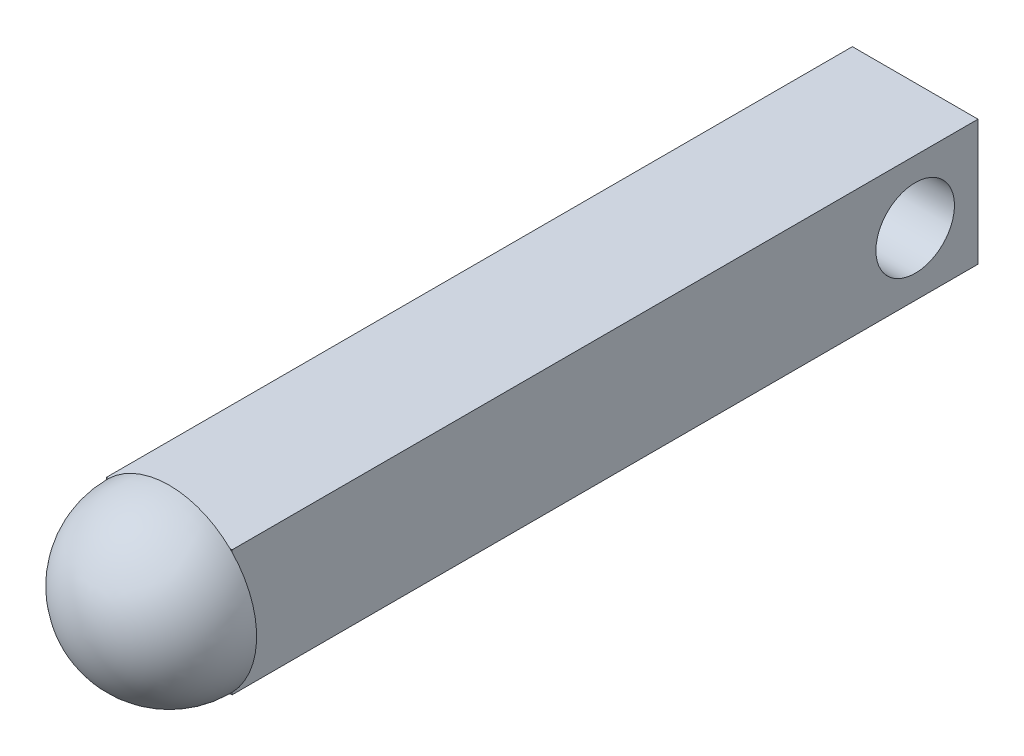
ISO-10303-21;
HEADER;
FILE_DESCRIPTION(('STEP AP214'),'2;1');
FILE_NAME('part.step','',(''),(''),'','','');
FILE_SCHEMA(('AUTOMOTIVE_DESIGN { 1 0 10303 214 1 1 1 1 }'));
ENDSEC;
DATA;
#1=APPLICATION_CONTEXT('core data for automotive mechanical design processes');
#2=APPLICATION_PROTOCOL_DEFINITION('international standard','automotive_design',2000,#1);
#3=PRODUCT_CONTEXT('',#1,'mechanical');
#4=PRODUCT('Part','Part','',(#3));
#5=PRODUCT_RELATED_PRODUCT_CATEGORY('part','',(#4));
#6=PRODUCT_DEFINITION_FORMATION('','',#4);
#7=PRODUCT_DEFINITION_CONTEXT('part definition',#1,'design');
#8=PRODUCT_DEFINITION('design','',#6,#7);
#9=PRODUCT_DEFINITION_SHAPE('','',#8);
#10=(LENGTH_UNIT() NAMED_UNIT(*) SI_UNIT(.MILLI.,.METRE.));
#11=(NAMED_UNIT(*) PLANE_ANGLE_UNIT() SI_UNIT($,.RADIAN.));
#12=(NAMED_UNIT(*) SI_UNIT($,.STERADIAN.) SOLID_ANGLE_UNIT());
#13=UNCERTAINTY_MEASURE_WITH_UNIT(LENGTH_MEASURE(1.E-05),#10,'distance_accuracy_value','');
#14=(GEOMETRIC_REPRESENTATION_CONTEXT(3) GLOBAL_UNCERTAINTY_ASSIGNED_CONTEXT((#13)) GLOBAL_UNIT_ASSIGNED_CONTEXT((#10,
#11,#12)) REPRESENTATION_CONTEXT('',''));
#15=CARTESIAN_POINT('',(0.,0.,0.));
#16=DIRECTION('',(0.,0.,1.));
#17=DIRECTION('',(1.,0.,0.));
#18=AXIS2_PLACEMENT_3D('',#15,#16,#17);
#19=CARTESIAN_POINT('',(0.,0.,95.));
#20=DIRECTION('',(0.,0.,-1.));
#21=DIRECTION('',(-1.,0.,0.));
#22=AXIS2_PLACEMENT_3D('',#19,#20,#21);
#23=PLANE('',#22);
#24=DIRECTION('',(0.,-1.,0.));
#25=VECTOR('',#24,1.);
#26=CARTESIAN_POINT('',(-8.,-8.,95.));
#27=LINE('',#26,#25);
#28=CARTESIAN_POINT('',(-8.,8.,95.));
#29=VERTEX_POINT('',#28);
#30=CARTESIAN_POINT('',(-8.,7.73115408192045,95.));
#31=VERTEX_POINT('',#30);
#32=EDGE_CURVE('E137',#29,#31,#27,.T.);
#33=ORIENTED_EDGE('',*,*,#32,.T.);
#34=CARTESIAN_POINT('',(0.,0.,95.));
#35=DIRECTION('',(0.,0.,-1.));
#36=DIRECTION('',(-1.,0.,0.));
#37=AXIS2_PLACEMENT_3D('',#34,#35,#36);
#38=CIRCLE('',#37,11.1252300397967);
#39=CARTESIAN_POINT('',(-7.73115408192046,8.,95.));
#40=VERTEX_POINT('',#39);
#41=EDGE_CURVE('E11',#31,#40,#38,.T.);
#42=ORIENTED_EDGE('',*,*,#41,.T.);
#43=DIRECTION('',(-1.,0.,0.));
#44=VECTOR('',#43,1.);
#45=CARTESIAN_POINT('',(-8.,8.,95.));
#46=LINE('',#45,#44);
#47=EDGE_CURVE('E131',#40,#29,#46,.T.);
#48=ORIENTED_EDGE('',*,*,#47,.T.);
#49=EDGE_LOOP('',(#33,#42,#48));
#50=FACE_BOUND('',#49,.T.);
#51=ADVANCED_FACE('F34',(#50),#23,.F.);
#52=CARTESIAN_POINT('',(8.,8.,95.));
#53=VERTEX_POINT('',#52);
#54=CARTESIAN_POINT('',(7.73115408192046,8.,95.));
#55=VERTEX_POINT('',#54);
#56=EDGE_CURVE('E128',#53,#55,#46,.T.);
#57=ORIENTED_EDGE('',*,*,#56,.T.);
#58=CARTESIAN_POINT('',(0.,0.,95.));
#59=DIRECTION('',(0.,0.,-1.));
#60=DIRECTION('',(0.,1.,0.));
#61=AXIS2_PLACEMENT_3D('',#58,#59,#60);
#62=CIRCLE('',#61,11.1252300397967);
#63=CARTESIAN_POINT('',(7.99999999999999,7.73115408192046,95.));
#64=VERTEX_POINT('',#63);
#65=EDGE_CURVE('E118',#55,#64,#62,.T.);
#66=ORIENTED_EDGE('',*,*,#65,.T.);
#67=DIRECTION('',(0.,1.,0.));
#68=VECTOR('',#67,1.);
#69=CARTESIAN_POINT('',(8.,-8.,95.));
#70=LINE('',#69,#68);
#71=EDGE_CURVE('E89',#64,#53,#70,.T.);
#72=ORIENTED_EDGE('',*,*,#71,.T.);
#73=EDGE_LOOP('',(#57,#66,#72));
#74=FACE_BOUND('',#73,.T.);
#75=ADVANCED_FACE('F133',(#74),#23,.F.);
#76=CARTESIAN_POINT('',(8.,-8.,95.));
#77=VERTEX_POINT('',#76);
#78=CARTESIAN_POINT('',(7.99999999999999,-7.73115408192046,95.));
#79=VERTEX_POINT('',#78);
#80=EDGE_CURVE('E139',#77,#79,#70,.T.);
#81=ORIENTED_EDGE('',*,*,#80,.T.);
#82=CARTESIAN_POINT('',(7.73115408192046,-8.,95.));
#83=VERTEX_POINT('',#82);
#84=EDGE_CURVE('E43',#79,#83,#38,.T.);
#85=ORIENTED_EDGE('',*,*,#84,.T.);
#86=DIRECTION('',(1.,0.,0.));
#87=VECTOR('',#86,1.);
#88=CARTESIAN_POINT('',(-8.,-8.,95.));
#89=LINE('',#88,#87);
#90=EDGE_CURVE('E59',#83,#77,#89,.T.);
#91=ORIENTED_EDGE('',*,*,#90,.T.);
#92=EDGE_LOOP('',(#81,#85,#91));
#93=FACE_BOUND('',#92,.T.);
#94=ADVANCED_FACE('F164',(#93),#23,.F.);
#95=CARTESIAN_POINT('',(8.,-8.,95.));
#96=DIRECTION('',(-1.,0.,0.));
#97=DIRECTION('',(0.,0.,1.));
#98=AXIS2_PLACEMENT_3D('',#95,#96,#97);
#99=PLANE('',#98);
#100=CARTESIAN_POINT('',(7.99999999999999,0.,8.));
#101=DIRECTION('',(-1.,0.,0.));
#102=DIRECTION('',(0.,0.,1.));
#103=AXIS2_PLACEMENT_3D('',#100,#101,#102);
#104=CIRCLE('',#103,5.);
#105=CARTESIAN_POINT('',(7.99999999999999,0.,13.));
#106=VERTEX_POINT('',#105);
#107=EDGE_CURVE('E181',#106,#106,#104,.T.);
#108=ORIENTED_EDGE('',*,*,#107,.T.);
#109=EDGE_LOOP('',(#108));
#110=FACE_BOUND('',#109,.T.);
#111=DIRECTION('',(0.,1.,0.));
#112=VECTOR('',#111,1.);
#113=CARTESIAN_POINT('',(8.,-8.,0.));
#114=LINE('',#113,#112);
#115=CARTESIAN_POINT('',(8.,-8.,0.));
#116=VERTEX_POINT('',#115);
#117=CARTESIAN_POINT('',(8.,8.,0.));
#118=VERTEX_POINT('',#117);
#119=EDGE_CURVE('E179',#116,#118,#114,.T.);
#120=ORIENTED_EDGE('',*,*,#119,.T.);
#121=DIRECTION('',(0.,0.,-1.));
#122=VECTOR('',#121,1.);
#123=CARTESIAN_POINT('',(8.,8.,95.));
#124=LINE('',#123,#122);
#125=EDGE_CURVE('E158',#53,#118,#124,.T.);
#126=ORIENTED_EDGE('',*,*,#125,.F.);
#127=ORIENTED_EDGE('',*,*,#71,.F.);
#128=EDGE_CURVE('E142',#79,#64,#70,.T.);
#129=ORIENTED_EDGE('',*,*,#128,.F.);
#130=ORIENTED_EDGE('',*,*,#80,.F.);
#131=DIRECTION('',(0.,0.,-1.));
#132=VECTOR('',#131,1.);
#133=CARTESIAN_POINT('',(8.,-8.,95.));
#134=LINE('',#133,#132);
#135=EDGE_CURVE('E151',#77,#116,#134,.T.);
#136=ORIENTED_EDGE('',*,*,#135,.T.);
#137=EDGE_LOOP('',(#120,#126,#127,#129,#130,#136));
#138=FACE_BOUND('',#137,.T.);
#139=ADVANCED_FACE('F36',(#110,#138),#99,.F.);
#140=CARTESIAN_POINT('',(-8.,8.,95.));
#141=DIRECTION('',(0.,-1.,0.));
#142=DIRECTION('',(0.,0.,-1.));
#143=AXIS2_PLACEMENT_3D('',#140,#141,#142);
#144=PLANE('',#143);
#145=DIRECTION('',(-1.,0.,0.));
#146=VECTOR('',#145,1.);
#147=CARTESIAN_POINT('',(-8.,8.,0.));
#148=LINE('',#147,#146);
#149=CARTESIAN_POINT('',(-8.,8.,0.));
#150=VERTEX_POINT('',#149);
#151=EDGE_CURVE('E147',#118,#150,#148,.T.);
#152=ORIENTED_EDGE('',*,*,#151,.T.);
#153=DIRECTION('',(0.,0.,-1.));
#154=VECTOR('',#153,1.);
#155=CARTESIAN_POINT('',(-8.,8.,95.));
#156=LINE('',#155,#154);
#157=EDGE_CURVE('E156',#29,#150,#156,.T.);
#158=ORIENTED_EDGE('',*,*,#157,.F.);
#159=ORIENTED_EDGE('',*,*,#47,.F.);
#160=EDGE_CURVE('E116',#55,#40,#46,.T.);
#161=ORIENTED_EDGE('',*,*,#160,.F.);
#162=ORIENTED_EDGE('',*,*,#56,.F.);
#163=ORIENTED_EDGE('',*,*,#125,.T.);
#164=EDGE_LOOP('',(#152,#158,#159,#161,#162,#163));
#165=FACE_BOUND('',#164,.T.);
#166=ADVANCED_FACE('F126',(#165),#144,.F.);
#167=CARTESIAN_POINT('',(-8.,-8.,95.));
#168=DIRECTION('',(1.,0.,0.));
#169=DIRECTION('',(0.,0.,-1.));
#170=AXIS2_PLACEMENT_3D('',#167,#168,#169);
#171=PLANE('',#170);
#172=CARTESIAN_POINT('',(-8.,0.,8.));
#173=DIRECTION('',(-1.,0.,0.));
#174=DIRECTION('',(0.,0.,1.));
#175=AXIS2_PLACEMENT_3D('',#172,#173,#174);
#176=CIRCLE('',#175,5.);
#177=CARTESIAN_POINT('',(-8.,0.,13.));
#178=VERTEX_POINT('',#177);
#179=EDGE_CURVE('E123',#178,#178,#176,.T.);
#180=ORIENTED_EDGE('',*,*,#179,.F.);
#181=EDGE_LOOP('',(#180));
#182=FACE_BOUND('',#181,.T.);
#183=DIRECTION('',(0.,-1.,0.));
#184=VECTOR('',#183,1.);
#185=CARTESIAN_POINT('',(-8.,-8.,0.));
#186=LINE('',#185,#184);
#187=CARTESIAN_POINT('',(-8.,-8.,0.));
#188=VERTEX_POINT('',#187);
#189=EDGE_CURVE('E145',#150,#188,#186,.T.);
#190=ORIENTED_EDGE('',*,*,#189,.T.);
#191=DIRECTION('',(0.,0.,-1.));
#192=VECTOR('',#191,1.);
#193=CARTESIAN_POINT('',(-8.,-8.,95.));
#194=LINE('',#193,#192);
#195=CARTESIAN_POINT('',(-8.,-8.,95.));
#196=VERTEX_POINT('',#195);
#197=EDGE_CURVE('E153',#196,#188,#194,.T.);
#198=ORIENTED_EDGE('',*,*,#197,.F.);
#199=CARTESIAN_POINT('',(-8.,-7.73115408192046,95.));
#200=VERTEX_POINT('',#199);
#201=EDGE_CURVE('E134',#200,#196,#27,.T.);
#202=ORIENTED_EDGE('',*,*,#201,.F.);
#203=EDGE_CURVE('E135',#31,#200,#27,.T.);
#204=ORIENTED_EDGE('',*,*,#203,.F.);
#205=ORIENTED_EDGE('',*,*,#32,.F.);
#206=ORIENTED_EDGE('',*,*,#157,.T.);
#207=EDGE_LOOP('',(#190,#198,#202,#204,#205,#206));
#208=FACE_BOUND('',#207,.T.);
#209=ADVANCED_FACE('F192',(#182,#208),#171,.F.);
#210=CARTESIAN_POINT('',(-8.,-8.,95.));
#211=DIRECTION('',(0.,1.,0.));
#212=DIRECTION('',(0.,0.,1.));
#213=AXIS2_PLACEMENT_3D('',#210,#211,#212);
#214=PLANE('',#213);
#215=DIRECTION('',(1.,0.,0.));
#216=VECTOR('',#215,1.);
#217=CARTESIAN_POINT('',(-8.,-8.,0.));
#218=LINE('',#217,#216);
#219=EDGE_CURVE('E81',#188,#116,#218,.T.);
#220=ORIENTED_EDGE('',*,*,#219,.T.);
#221=ORIENTED_EDGE('',*,*,#135,.F.);
#222=ORIENTED_EDGE('',*,*,#90,.F.);
#223=CARTESIAN_POINT('',(-7.73115408192046,-8.,95.));
#224=VERTEX_POINT('',#223);
#225=EDGE_CURVE('E169',#224,#83,#89,.T.);
#226=ORIENTED_EDGE('',*,*,#225,.F.);
#227=EDGE_CURVE('E154',#196,#224,#89,.T.);
#228=ORIENTED_EDGE('',*,*,#227,.F.);
#229=ORIENTED_EDGE('',*,*,#197,.T.);
#230=EDGE_LOOP('',(#220,#221,#222,#226,#228,#229));
#231=FACE_BOUND('',#230,.T.);
#232=ADVANCED_FACE('F167',(#231),#214,.F.);
#233=ORIENTED_EDGE('',*,*,#227,.T.);
#234=EDGE_CURVE('E38',#224,#200,#38,.T.);
#235=ORIENTED_EDGE('',*,*,#234,.T.);
#236=ORIENTED_EDGE('',*,*,#201,.T.);
#237=EDGE_LOOP('',(#233,#235,#236));
#238=FACE_BOUND('',#237,.T.);
#239=ADVANCED_FACE('F172',(#238),#23,.F.);
#240=CARTESIAN_POINT('',(0.,0.,0.));
#241=DIRECTION('',(0.,0.,-1.));
#242=DIRECTION('',(-1.,0.,0.));
#243=AXIS2_PLACEMENT_3D('',#240,#241,#242);
#244=PLANE('',#243);
#245=ORIENTED_EDGE('',*,*,#119,.F.);
#246=ORIENTED_EDGE('',*,*,#219,.F.);
#247=ORIENTED_EDGE('',*,*,#189,.F.);
#248=ORIENTED_EDGE('',*,*,#151,.F.);
#249=EDGE_LOOP('',(#245,#246,#247,#248));
#250=FACE_BOUND('',#249,.T.);
#251=ADVANCED_FACE('F178',(#250),#244,.T.);
#252=CARTESIAN_POINT('',(67.,0.,8.));
#253=DIRECTION('',(-1.,0.,0.));
#254=DIRECTION('',(0.,0.,1.));
#255=AXIS2_PLACEMENT_3D('',#252,#253,#254);
#256=CYLINDRICAL_SURFACE('',#255,5.);
#257=ORIENTED_EDGE('',*,*,#179,.T.);
#258=EDGE_LOOP('',(#257));
#259=FACE_BOUND('',#258,.T.);
#260=ORIENTED_EDGE('',*,*,#107,.F.);
#261=EDGE_LOOP('',(#260));
#262=FACE_BOUND('',#261,.T.);
#263=ADVANCED_FACE('F189',(#259,#262),#256,.F.);
#264=CARTESIAN_POINT('',(0.,11.1252300397967,95.));
#265=DIRECTION('',(0.,0.,-1.));
#266=DIRECTION('',(0.,1.,0.));
#267=AXIS2_PLACEMENT_3D('',#264,#265,#266);
#268=PLANE('',#267);
#269=ORIENTED_EDGE('',*,*,#128,.T.);
#270=EDGE_CURVE('E122',#64,#79,#62,.T.);
#271=ORIENTED_EDGE('',*,*,#270,.T.);
#272=EDGE_LOOP('',(#269,#271));
#273=FACE_BOUND('',#272,.T.);
#274=ADVANCED_FACE('F204',(#273),#268,.T.);
#275=ORIENTED_EDGE('',*,*,#160,.T.);
#276=EDGE_CURVE('E112',#40,#55,#62,.T.);
#277=ORIENTED_EDGE('',*,*,#276,.T.);
#278=EDGE_LOOP('',(#275,#277));
#279=FACE_BOUND('',#278,.T.);
#280=ADVANCED_FACE('F114',(#279),#268,.T.);
#281=ORIENTED_EDGE('',*,*,#203,.T.);
#282=EDGE_CURVE('E50',#200,#31,#62,.T.);
#283=ORIENTED_EDGE('',*,*,#282,.T.);
#284=EDGE_LOOP('',(#281,#283));
#285=FACE_BOUND('',#284,.T.);
#286=ADVANCED_FACE('F198',(#285),#268,.T.);
#287=ORIENTED_EDGE('',*,*,#225,.T.);
#288=EDGE_CURVE('E199',#83,#224,#62,.T.);
#289=ORIENTED_EDGE('',*,*,#288,.T.);
#290=EDGE_LOOP('',(#287,#289));
#291=FACE_BOUND('',#290,.T.);
#292=ADVANCED_FACE('F284',(#291),#268,.T.);
#293=CARTESIAN_POINT('',(0.,0.,95.));
#294=DIRECTION('',(0.,0.,-1.));
#295=DIRECTION('',(0.,1.,0.));
#296=AXIS2_PLACEMENT_3D('',#293,#294,#295);
#297=SPHERICAL_SURFACE('',#296,11.1252300397967);
#298=ORIENTED_EDGE('',*,*,#65,.F.);
#299=ORIENTED_EDGE('',*,*,#276,.F.);
#300=ORIENTED_EDGE('',*,*,#41,.F.);
#301=ORIENTED_EDGE('',*,*,#282,.F.);
#302=ORIENTED_EDGE('',*,*,#234,.F.);
#303=ORIENTED_EDGE('',*,*,#288,.F.);
#304=ORIENTED_EDGE('',*,*,#84,.F.);
#305=ORIENTED_EDGE('',*,*,#270,.F.);
#306=EDGE_LOOP('',(#298,#299,#300,#301,#302,#303,#304,#305));
#307=FACE_BOUND('',#306,.T.);
#308=ADVANCED_FACE('F120',(#307),#297,.T.);
#309=CLOSED_SHELL('',(#51,#75,#94,#139,#166,#209,#232,#239,#251,#263,#274,#280,#286,#292,#308));
#310=MANIFOLD_SOLID_BREP('B2',#309);
#311=ADVANCED_BREP_SHAPE_REPRESENTATION('',(#18,#310),#14);
#312=SHAPE_DEFINITION_REPRESENTATION(#9,#311);
ENDSEC;
END-ISO-10303-21;
